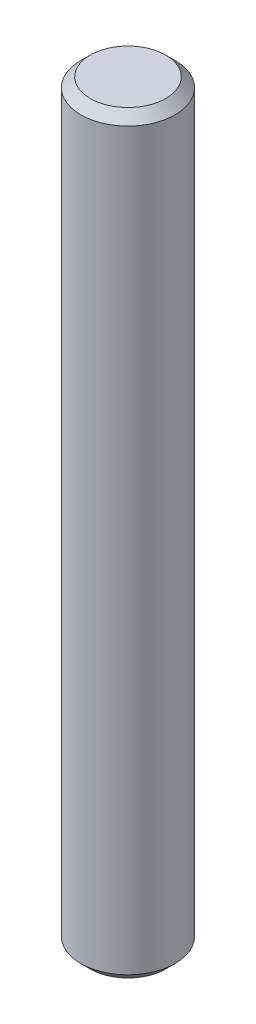
ISO-10303-21;
HEADER;
FILE_DESCRIPTION(('STEP AP214'),'2;1');
FILE_NAME('part.step','',(''),(''),'','','');
FILE_SCHEMA(('AUTOMOTIVE_DESIGN { 1 0 10303 214 1 1 1 1 }'));
ENDSEC;
DATA;
#1=APPLICATION_CONTEXT('core data for automotive mechanical design processes');
#2=APPLICATION_PROTOCOL_DEFINITION('international standard','automotive_design',2000,#1);
#3=PRODUCT_CONTEXT('',#1,'mechanical');
#4=PRODUCT('Part','Part','',(#3));
#5=PRODUCT_RELATED_PRODUCT_CATEGORY('part','',(#4));
#6=PRODUCT_DEFINITION_FORMATION('','',#4);
#7=PRODUCT_DEFINITION_CONTEXT('part definition',#1,'design');
#8=PRODUCT_DEFINITION('design','',#6,#7);
#9=PRODUCT_DEFINITION_SHAPE('','',#8);
#10=(LENGTH_UNIT() NAMED_UNIT(*) SI_UNIT(.MILLI.,.METRE.));
#11=(NAMED_UNIT(*) PLANE_ANGLE_UNIT() SI_UNIT($,.RADIAN.));
#12=(NAMED_UNIT(*) SI_UNIT($,.STERADIAN.) SOLID_ANGLE_UNIT());
#13=UNCERTAINTY_MEASURE_WITH_UNIT(LENGTH_MEASURE(1.E-05),#10,'distance_accuracy_value','');
#14=(GEOMETRIC_REPRESENTATION_CONTEXT(3) GLOBAL_UNCERTAINTY_ASSIGNED_CONTEXT((#13)) GLOBAL_UNIT_ASSIGNED_CONTEXT((#10,
#11,#12)) REPRESENTATION_CONTEXT('',''));
#15=CARTESIAN_POINT('',(0.,0.,0.));
#16=DIRECTION('',(0.,0.,1.));
#17=DIRECTION('',(1.,0.,0.));
#18=AXIS2_PLACEMENT_3D('',#15,#16,#17);
#19=CARTESIAN_POINT('',(0.,40.,0.));
#20=DIRECTION('',(0.,-1.,0.));
#21=DIRECTION('',(0.,0.,-1.));
#22=AXIS2_PLACEMENT_3D('',#19,#20,#21);
#23=CYLINDRICAL_SURFACE('',#22,2.5);
#24=CARTESIAN_POINT('',(0.,0.499999999999994,0.));
#25=DIRECTION('',(0.,1.,0.));
#26=DIRECTION('',(0.,0.,1.));
#27=AXIS2_PLACEMENT_3D('',#24,#25,#26);
#28=CIRCLE('',#27,2.5);
#29=CARTESIAN_POINT('',(0.,0.499999999999994,2.5));
#30=VERTEX_POINT('',#29);
#31=EDGE_CURVE('E57',#30,#30,#28,.T.);
#32=ORIENTED_EDGE('',*,*,#31,.T.);
#33=EDGE_LOOP('',(#32));
#34=FACE_BOUND('',#33,.T.);
#35=CARTESIAN_POINT('',(0.,39.5,0.));
#36=DIRECTION('',(0.,1.,0.));
#37=DIRECTION('',(0.,0.,1.));
#38=AXIS2_PLACEMENT_3D('',#35,#36,#37);
#39=CIRCLE('',#38,2.5);
#40=CARTESIAN_POINT('',(0.,39.5,2.5));
#41=VERTEX_POINT('',#40);
#42=EDGE_CURVE('E62',#41,#41,#39,.F.);
#43=ORIENTED_EDGE('',*,*,#42,.T.);
#44=EDGE_LOOP('',(#43));
#45=FACE_BOUND('',#44,.T.);
#46=ADVANCED_FACE('F43',(#34,#45),#23,.T.);
#47=CARTESIAN_POINT('',(0.,40.,0.));
#48=DIRECTION('',(0.,1.,0.));
#49=DIRECTION('',(0.,0.,1.));
#50=AXIS2_PLACEMENT_3D('',#47,#48,#49);
#51=PLANE('',#50);
#52=CARTESIAN_POINT('',(0.,40.,0.));
#53=DIRECTION('',(0.,1.,0.));
#54=DIRECTION('',(0.,0.,1.));
#55=AXIS2_PLACEMENT_3D('',#52,#53,#54);
#56=CIRCLE('',#55,2.);
#57=CARTESIAN_POINT('',(0.,40.,2.));
#58=VERTEX_POINT('',#57);
#59=EDGE_CURVE('E10',#58,#58,#56,.T.);
#60=ORIENTED_EDGE('',*,*,#59,.T.);
#61=EDGE_LOOP('',(#60));
#62=FACE_BOUND('',#61,.T.);
#63=ADVANCED_FACE('F79',(#62),#51,.T.);
#64=CARTESIAN_POINT('',(0.,0.,0.));
#65=DIRECTION('',(0.,1.,0.));
#66=DIRECTION('',(0.,0.,1.));
#67=AXIS2_PLACEMENT_3D('',#64,#65,#66);
#68=PLANE('',#67);
#69=CARTESIAN_POINT('',(0.,0.,0.));
#70=DIRECTION('',(0.,1.,0.));
#71=DIRECTION('',(0.,0.,1.));
#72=AXIS2_PLACEMENT_3D('',#69,#70,#71);
#73=CIRCLE('',#72,2.00000000000001);
#74=CARTESIAN_POINT('',(0.,0.,2.00000000000001));
#75=VERTEX_POINT('',#74);
#76=EDGE_CURVE('E52',#75,#75,#73,.F.);
#77=ORIENTED_EDGE('',*,*,#76,.T.);
#78=EDGE_LOOP('',(#77));
#79=FACE_BOUND('',#78,.T.);
#80=ADVANCED_FACE('F76',(#79),#68,.F.);
#81=CARTESIAN_POINT('',(0.,0.499999999999994,0.));
#82=DIRECTION('',(0.,1.,0.));
#83=DIRECTION('',(0.,0.,1.));
#84=AXIS2_PLACEMENT_3D('',#81,#82,#83);
#85=CONICAL_SURFACE('',#84,2.5,0.785398163397447);
#86=ORIENTED_EDGE('',*,*,#76,.F.);
#87=EDGE_LOOP('',(#86));
#88=FACE_BOUND('',#87,.T.);
#89=ORIENTED_EDGE('',*,*,#31,.F.);
#90=EDGE_LOOP('',(#89));
#91=FACE_BOUND('',#90,.T.);
#92=ADVANCED_FACE('F72',(#88,#91),#85,.T.);
#93=CARTESIAN_POINT('',(0.,40.,0.));
#94=DIRECTION('',(0.,-1.,0.));
#95=DIRECTION('',(0.,0.,-1.));
#96=AXIS2_PLACEMENT_3D('',#93,#94,#95);
#97=CONICAL_SURFACE('',#96,2.,0.785398163397447);
#98=ORIENTED_EDGE('',*,*,#42,.F.);
#99=EDGE_LOOP('',(#98));
#100=FACE_BOUND('',#99,.T.);
#101=ORIENTED_EDGE('',*,*,#59,.F.);
#102=EDGE_LOOP('',(#101));
#103=FACE_BOUND('',#102,.T.);
#104=ADVANCED_FACE('F46',(#100,#103),#97,.T.);
#105=CLOSED_SHELL('',(#46,#63,#80,#92,#104));
#106=MANIFOLD_SOLID_BREP('B2',#105);
#107=ADVANCED_BREP_SHAPE_REPRESENTATION('',(#18,#106),#14);
#108=SHAPE_DEFINITION_REPRESENTATION(#9,#107);
ENDSEC;
END-ISO-10303-21;
